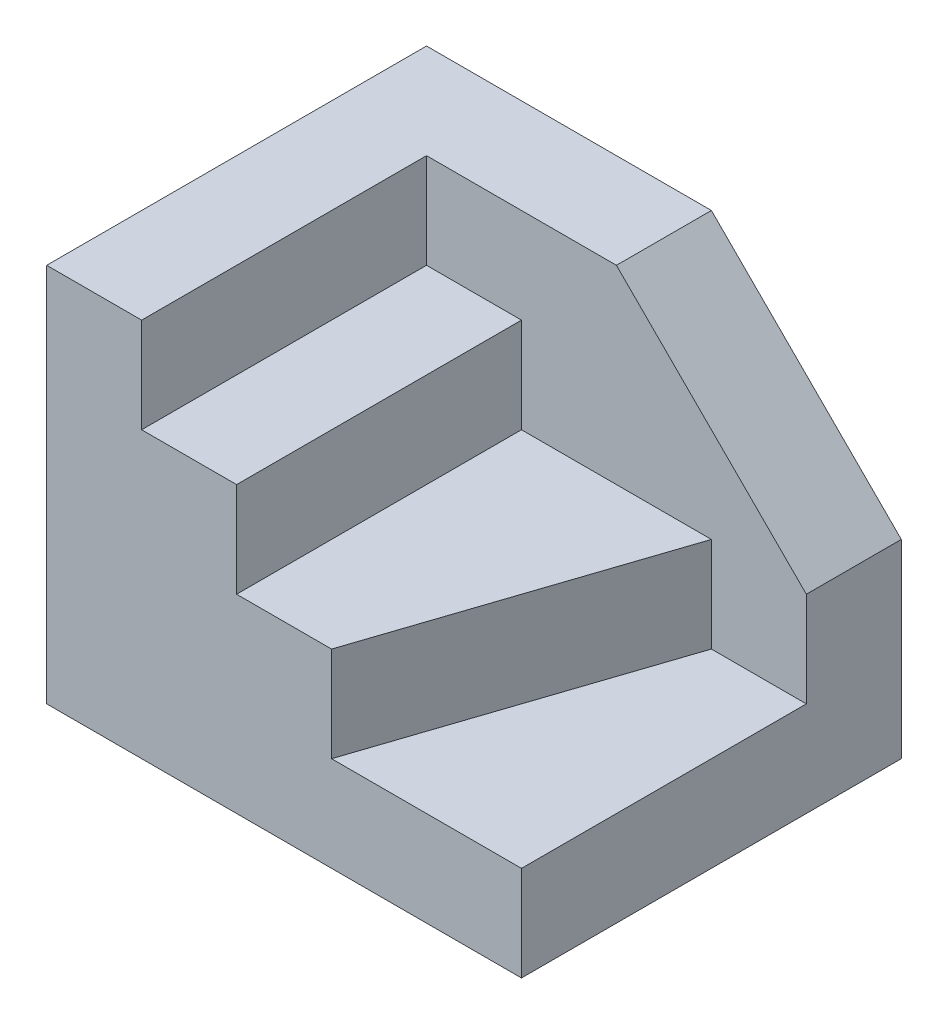
ISO-10303-21;
HEADER;
FILE_DESCRIPTION(('STEP AP214'),'2;1');
FILE_NAME('part.step','',(''),(''),'','','');
FILE_SCHEMA(('AUTOMOTIVE_DESIGN { 1 0 10303 214 1 1 1 1 }'));
ENDSEC;
DATA;
#1=APPLICATION_CONTEXT('core data for automotive mechanical design processes');
#2=APPLICATION_PROTOCOL_DEFINITION('international standard','automotive_design',2000,#1);
#3=PRODUCT_CONTEXT('',#1,'mechanical');
#4=PRODUCT('Part','Part','',(#3));
#5=PRODUCT_RELATED_PRODUCT_CATEGORY('part','',(#4));
#6=PRODUCT_DEFINITION_FORMATION('','',#4);
#7=PRODUCT_DEFINITION_CONTEXT('part definition',#1,'design');
#8=PRODUCT_DEFINITION('design','',#6,#7);
#9=PRODUCT_DEFINITION_SHAPE('','',#8);
#10=(LENGTH_UNIT() NAMED_UNIT(*) SI_UNIT(.MILLI.,.METRE.));
#11=(NAMED_UNIT(*) PLANE_ANGLE_UNIT() SI_UNIT($,.RADIAN.));
#12=(NAMED_UNIT(*) SI_UNIT($,.STERADIAN.) SOLID_ANGLE_UNIT());
#13=UNCERTAINTY_MEASURE_WITH_UNIT(LENGTH_MEASURE(1.E-05),#10,'distance_accuracy_value','');
#14=(GEOMETRIC_REPRESENTATION_CONTEXT(3) GLOBAL_UNCERTAINTY_ASSIGNED_CONTEXT((#13)) GLOBAL_UNIT_ASSIGNED_CONTEXT((#10,
#11,#12)) REPRESENTATION_CONTEXT('',''));
#15=CARTESIAN_POINT('',(0.,0.,0.));
#16=DIRECTION('',(0.,0.,1.));
#17=DIRECTION('',(1.,0.,0.));
#18=AXIS2_PLACEMENT_3D('',#15,#16,#17);
#19=CARTESIAN_POINT('',(0.,1.,0.));
#20=DIRECTION('',(0.,-1.,0.));
#21=DIRECTION('',(0.,0.,-1.));
#22=AXIS2_PLACEMENT_3D('',#19,#20,#21);
#23=PLANE('',#22);
#24=DIRECTION('',(0.316227766016838,0.,-0.948683298050514));
#25=VECTOR('',#24,1.);
#26=CARTESIAN_POINT('',(4.,1.,-3.));
#27=LINE('',#26,#25);
#28=CARTESIAN_POINT('',(3.,1.,0.));
#29=VERTEX_POINT('',#28);
#30=CARTESIAN_POINT('',(4.,1.,-3.));
#31=VERTEX_POINT('',#30);
#32=EDGE_CURVE('E144',#29,#31,#27,.T.);
#33=ORIENTED_EDGE('',*,*,#32,.F.);
#34=DIRECTION('',(1.,0.,0.));
#35=VECTOR('',#34,1.);
#36=CARTESIAN_POINT('',(5.,1.,0.));
#37=LINE('',#36,#35);
#38=CARTESIAN_POINT('',(5.,1.,0.));
#39=VERTEX_POINT('',#38);
#40=EDGE_CURVE('E131',#29,#39,#37,.T.);
#41=ORIENTED_EDGE('',*,*,#40,.T.);
#42=DIRECTION('',(0.,0.,-1.));
#43=VECTOR('',#42,1.);
#44=CARTESIAN_POINT('',(5.,1.,-4.));
#45=LINE('',#44,#43);
#46=CARTESIAN_POINT('',(5.,1.,-3.));
#47=VERTEX_POINT('',#46);
#48=EDGE_CURVE('E202',#39,#47,#45,.T.);
#49=ORIENTED_EDGE('',*,*,#48,.T.);
#50=DIRECTION('',(-1.,0.,0.));
#51=VECTOR('',#50,1.);
#52=CARTESIAN_POINT('',(5.,1.,-3.));
#53=LINE('',#52,#51);
#54=EDGE_CURVE('E177',#47,#31,#53,.T.);
#55=ORIENTED_EDGE('',*,*,#54,.T.);
#56=EDGE_LOOP('',(#33,#41,#49,#55));
#57=FACE_BOUND('',#56,.T.);
#58=ADVANCED_FACE('F35',(#57),#23,.F.);
#59=CARTESIAN_POINT('',(0.,0.,-3.));
#60=DIRECTION('',(0.,0.,-1.));
#61=DIRECTION('',(-1.,0.,0.));
#62=AXIS2_PLACEMENT_3D('',#59,#60,#61);
#63=PLANE('',#62);
#64=DIRECTION('',(0.,-1.,0.));
#65=VECTOR('',#64,1.);
#66=CARTESIAN_POINT('',(4.,2.,-3.));
#67=LINE('',#66,#65);
#68=CARTESIAN_POINT('',(4.,2.,-3.));
#69=VERTEX_POINT('',#68);
#70=EDGE_CURVE('E55',#69,#31,#67,.T.);
#71=ORIENTED_EDGE('',*,*,#70,.T.);
#72=ORIENTED_EDGE('',*,*,#54,.F.);
#73=DIRECTION('',(0.,-1.,0.));
#74=VECTOR('',#73,1.);
#75=CARTESIAN_POINT('',(5.,2.,-3.));
#76=LINE('',#75,#74);
#77=CARTESIAN_POINT('',(5.,2.,-3.));
#78=VERTEX_POINT('',#77);
#79=EDGE_CURVE('E185',#78,#47,#76,.T.);
#80=ORIENTED_EDGE('',*,*,#79,.F.);
#81=DIRECTION('',(0.707106781186548,-0.707106781186547,0.));
#82=VECTOR('',#81,1.);
#83=CARTESIAN_POINT('',(3.,4.,-3.));
#84=LINE('',#83,#82);
#85=CARTESIAN_POINT('',(3.,4.,-3.));
#86=VERTEX_POINT('',#85);
#87=EDGE_CURVE('E182',#86,#78,#84,.T.);
#88=ORIENTED_EDGE('',*,*,#87,.F.);
#89=DIRECTION('',(1.,0.,0.));
#90=VECTOR('',#89,1.);
#91=CARTESIAN_POINT('',(0.,4.,-3.));
#92=LINE('',#91,#90);
#93=CARTESIAN_POINT('',(1.,4.,-3.));
#94=VERTEX_POINT('',#93);
#95=EDGE_CURVE('E179',#94,#86,#92,.T.);
#96=ORIENTED_EDGE('',*,*,#95,.F.);
#97=DIRECTION('',(0.,1.,0.));
#98=VECTOR('',#97,1.);
#99=CARTESIAN_POINT('',(1.,4.,-3.));
#100=LINE('',#99,#98);
#101=CARTESIAN_POINT('',(1.,3.,-3.));
#102=VERTEX_POINT('',#101);
#103=EDGE_CURVE('E157',#102,#94,#100,.T.);
#104=ORIENTED_EDGE('',*,*,#103,.F.);
#105=DIRECTION('',(-1.,0.,0.));
#106=VECTOR('',#105,1.);
#107=CARTESIAN_POINT('',(1.,3.,-3.));
#108=LINE('',#107,#106);
#109=CARTESIAN_POINT('',(2.,3.,-3.));
#110=VERTEX_POINT('',#109);
#111=EDGE_CURVE('E154',#110,#102,#108,.T.);
#112=ORIENTED_EDGE('',*,*,#111,.F.);
#113=DIRECTION('',(0.,1.,0.));
#114=VECTOR('',#113,1.);
#115=CARTESIAN_POINT('',(2.,3.,-3.));
#116=LINE('',#115,#114);
#117=CARTESIAN_POINT('',(2.,2.,-3.));
#118=VERTEX_POINT('',#117);
#119=EDGE_CURVE('E150',#118,#110,#116,.T.);
#120=ORIENTED_EDGE('',*,*,#119,.F.);
#121=DIRECTION('',(-1.,0.,0.));
#122=VECTOR('',#121,1.);
#123=CARTESIAN_POINT('',(2.,2.,-3.));
#124=LINE('',#123,#122);
#125=EDGE_CURVE('E50',#69,#118,#124,.T.);
#126=ORIENTED_EDGE('',*,*,#125,.F.);
#127=EDGE_LOOP('',(#71,#72,#80,#88,#96,#104,#112,#120,#126));
#128=FACE_BOUND('',#127,.T.);
#129=ADVANCED_FACE('F244',(#128),#63,.F.);
#130=CARTESIAN_POINT('',(5.,1.,0.));
#131=DIRECTION('',(0.,0.,-1.));
#132=DIRECTION('',(-1.,0.,0.));
#133=AXIS2_PLACEMENT_3D('',#130,#131,#132);
#134=PLANE('',#133);
#135=DIRECTION('',(1.,0.,0.));
#136=VECTOR('',#135,1.);
#137=CARTESIAN_POINT('',(5.,0.,0.));
#138=LINE('',#137,#136);
#139=CARTESIAN_POINT('',(0.,0.,0.));
#140=VERTEX_POINT('',#139);
#141=CARTESIAN_POINT('',(5.,0.,0.));
#142=VERTEX_POINT('',#141);
#143=EDGE_CURVE('E196',#140,#142,#138,.T.);
#144=ORIENTED_EDGE('',*,*,#143,.T.);
#145=DIRECTION('',(0.,-1.,0.));
#146=VECTOR('',#145,1.);
#147=CARTESIAN_POINT('',(5.,1.,0.));
#148=LINE('',#147,#146);
#149=EDGE_CURVE('E11',#39,#142,#148,.T.);
#150=ORIENTED_EDGE('',*,*,#149,.F.);
#151=ORIENTED_EDGE('',*,*,#40,.F.);
#152=DIRECTION('',(0.,1.,0.));
#153=VECTOR('',#152,1.);
#154=CARTESIAN_POINT('',(3.,2.,0.));
#155=LINE('',#154,#153);
#156=CARTESIAN_POINT('',(3.,2.,0.));
#157=VERTEX_POINT('',#156);
#158=EDGE_CURVE('E125',#29,#157,#155,.T.);
#159=ORIENTED_EDGE('',*,*,#158,.T.);
#160=DIRECTION('',(-1.,0.,0.));
#161=VECTOR('',#160,1.);
#162=CARTESIAN_POINT('',(2.,2.,0.));
#163=LINE('',#162,#161);
#164=CARTESIAN_POINT('',(2.,2.,0.));
#165=VERTEX_POINT('',#164);
#166=EDGE_CURVE('E129',#157,#165,#163,.T.);
#167=ORIENTED_EDGE('',*,*,#166,.T.);
#168=DIRECTION('',(0.,1.,0.));
#169=VECTOR('',#168,1.);
#170=CARTESIAN_POINT('',(2.,3.,0.));
#171=LINE('',#170,#169);
#172=CARTESIAN_POINT('',(2.,3.,0.));
#173=VERTEX_POINT('',#172);
#174=EDGE_CURVE('E141',#165,#173,#171,.T.);
#175=ORIENTED_EDGE('',*,*,#174,.T.);
#176=DIRECTION('',(-1.,0.,0.));
#177=VECTOR('',#176,1.);
#178=CARTESIAN_POINT('',(1.,3.,0.));
#179=LINE('',#178,#177);
#180=CARTESIAN_POINT('',(1.,3.,0.));
#181=VERTEX_POINT('',#180);
#182=EDGE_CURVE('E161',#173,#181,#179,.T.);
#183=ORIENTED_EDGE('',*,*,#182,.T.);
#184=DIRECTION('',(0.,1.,0.));
#185=VECTOR('',#184,1.);
#186=CARTESIAN_POINT('',(1.,4.,0.));
#187=LINE('',#186,#185);
#188=CARTESIAN_POINT('',(1.,4.,0.));
#189=VERTEX_POINT('',#188);
#190=EDGE_CURVE('E164',#181,#189,#187,.T.);
#191=ORIENTED_EDGE('',*,*,#190,.T.);
#192=DIRECTION('',(-1.,0.,0.));
#193=VECTOR('',#192,1.);
#194=CARTESIAN_POINT('',(0.,4.,0.));
#195=LINE('',#194,#193);
#196=CARTESIAN_POINT('',(0.,4.,0.));
#197=VERTEX_POINT('',#196);
#198=EDGE_CURVE('E151',#189,#197,#195,.T.);
#199=ORIENTED_EDGE('',*,*,#198,.T.);
#200=DIRECTION('',(0.,-1.,0.));
#201=VECTOR('',#200,1.);
#202=CARTESIAN_POINT('',(0.,1.,0.));
#203=LINE('',#202,#201);
#204=EDGE_CURVE('E206',#197,#140,#203,.T.);
#205=ORIENTED_EDGE('',*,*,#204,.T.);
#206=EDGE_LOOP('',(#144,#150,#151,#159,#167,#175,#183,#191,#199,#205));
#207=FACE_BOUND('',#206,.T.);
#208=ADVANCED_FACE('F37',(#207),#134,.F.);
#209=CARTESIAN_POINT('',(5.,1.,-4.));
#210=DIRECTION('',(-1.,0.,0.));
#211=DIRECTION('',(0.,0.,1.));
#212=AXIS2_PLACEMENT_3D('',#209,#210,#211);
#213=PLANE('',#212);
#214=DIRECTION('',(0.,0.,-1.));
#215=VECTOR('',#214,1.);
#216=CARTESIAN_POINT('',(5.,0.,-4.));
#217=LINE('',#216,#215);
#218=CARTESIAN_POINT('',(5.,0.,-4.));
#219=VERTEX_POINT('',#218);
#220=EDGE_CURVE('E208',#142,#219,#217,.T.);
#221=ORIENTED_EDGE('',*,*,#220,.T.);
#222=DIRECTION('',(0.,-1.,0.));
#223=VECTOR('',#222,1.);
#224=CARTESIAN_POINT('',(5.,1.,-4.));
#225=LINE('',#224,#223);
#226=CARTESIAN_POINT('',(5.,2.,-4.));
#227=VERTEX_POINT('',#226);
#228=EDGE_CURVE('E43',#227,#219,#225,.T.);
#229=ORIENTED_EDGE('',*,*,#228,.F.);
#230=DIRECTION('',(0.,0.,-1.));
#231=VECTOR('',#230,1.);
#232=CARTESIAN_POINT('',(5.,2.,-3.));
#233=LINE('',#232,#231);
#234=EDGE_CURVE('E193',#78,#227,#233,.T.);
#235=ORIENTED_EDGE('',*,*,#234,.F.);
#236=ORIENTED_EDGE('',*,*,#79,.T.);
#237=ORIENTED_EDGE('',*,*,#48,.F.);
#238=ORIENTED_EDGE('',*,*,#149,.T.);
#239=EDGE_LOOP('',(#221,#229,#235,#236,#237,#238));
#240=FACE_BOUND('',#239,.T.);
#241=ADVANCED_FACE('F241',(#240),#213,.F.);
#242=CARTESIAN_POINT('',(0.,1.,-4.));
#243=DIRECTION('',(0.,0.,1.));
#244=DIRECTION('',(1.,0.,0.));
#245=AXIS2_PLACEMENT_3D('',#242,#243,#244);
#246=PLANE('',#245);
#247=DIRECTION('',(-1.,0.,0.));
#248=VECTOR('',#247,1.);
#249=CARTESIAN_POINT('',(0.,0.,-4.));
#250=LINE('',#249,#248);
#251=CARTESIAN_POINT('',(0.,0.,-4.));
#252=VERTEX_POINT('',#251);
#253=EDGE_CURVE('E210',#219,#252,#250,.T.);
#254=ORIENTED_EDGE('',*,*,#253,.T.);
#255=DIRECTION('',(0.,-1.,0.));
#256=VECTOR('',#255,1.);
#257=CARTESIAN_POINT('',(0.,1.,-4.));
#258=LINE('',#257,#256);
#259=CARTESIAN_POINT('',(0.,4.,-4.));
#260=VERTEX_POINT('',#259);
#261=EDGE_CURVE('E215',#260,#252,#258,.T.);
#262=ORIENTED_EDGE('',*,*,#261,.F.);
#263=DIRECTION('',(1.,0.,0.));
#264=VECTOR('',#263,1.);
#265=CARTESIAN_POINT('',(0.,4.,-4.));
#266=LINE('',#265,#264);
#267=CARTESIAN_POINT('',(3.,4.,-4.));
#268=VERTEX_POINT('',#267);
#269=EDGE_CURVE('E171',#260,#268,#266,.T.);
#270=ORIENTED_EDGE('',*,*,#269,.T.);
#271=DIRECTION('',(0.707106781186548,-0.707106781186547,0.));
#272=VECTOR('',#271,1.);
#273=CARTESIAN_POINT('',(3.,4.,-4.));
#274=LINE('',#273,#272);
#275=EDGE_CURVE('E180',#268,#227,#274,.T.);
#276=ORIENTED_EDGE('',*,*,#275,.T.);
#277=ORIENTED_EDGE('',*,*,#228,.T.);
#278=EDGE_LOOP('',(#254,#262,#270,#276,#277));
#279=FACE_BOUND('',#278,.T.);
#280=ADVANCED_FACE('F220',(#279),#246,.F.);
#281=CARTESIAN_POINT('',(0.,1.,0.));
#282=DIRECTION('',(1.,0.,0.));
#283=DIRECTION('',(0.,0.,-1.));
#284=AXIS2_PLACEMENT_3D('',#281,#282,#283);
#285=PLANE('',#284);
#286=ORIENTED_EDGE('',*,*,#204,.F.);
#287=DIRECTION('',(0.,0.,-1.));
#288=VECTOR('',#287,1.);
#289=CARTESIAN_POINT('',(0.,4.,-3.));
#290=LINE('',#289,#288);
#291=EDGE_CURVE('E188',#197,#260,#290,.T.);
#292=ORIENTED_EDGE('',*,*,#291,.T.);
#293=ORIENTED_EDGE('',*,*,#261,.T.);
#294=DIRECTION('',(0.,0.,1.));
#295=VECTOR('',#294,1.);
#296=CARTESIAN_POINT('',(0.,0.,0.));
#297=LINE('',#296,#295);
#298=EDGE_CURVE('E203',#252,#140,#297,.T.);
#299=ORIENTED_EDGE('',*,*,#298,.T.);
#300=EDGE_LOOP('',(#286,#292,#293,#299));
#301=FACE_BOUND('',#300,.T.);
#302=ADVANCED_FACE('F228',(#301),#285,.F.);
#303=CARTESIAN_POINT('',(0.,0.,0.));
#304=DIRECTION('',(0.,-1.,0.));
#305=DIRECTION('',(0.,0.,-1.));
#306=AXIS2_PLACEMENT_3D('',#303,#304,#305);
#307=PLANE('',#306);
#308=ORIENTED_EDGE('',*,*,#143,.F.);
#309=ORIENTED_EDGE('',*,*,#298,.F.);
#310=ORIENTED_EDGE('',*,*,#253,.F.);
#311=ORIENTED_EDGE('',*,*,#220,.F.);
#312=EDGE_LOOP('',(#308,#309,#310,#311));
#313=FACE_BOUND('',#312,.T.);
#314=ADVANCED_FACE('F226',(#313),#307,.T.);
#315=CARTESIAN_POINT('',(3.,4.,-3.));
#316=DIRECTION('',(0.707106781186547,0.707106781186548,0.));
#317=DIRECTION('',(-0.707106781186548,0.707106781186547,0.));
#318=AXIS2_PLACEMENT_3D('',#315,#316,#317);
#319=PLANE('',#318);
#320=ORIENTED_EDGE('',*,*,#275,.F.);
#321=DIRECTION('',(0.,0.,-1.));
#322=VECTOR('',#321,1.);
#323=CARTESIAN_POINT('',(3.,4.,-3.));
#324=LINE('',#323,#322);
#325=EDGE_CURVE('E197',#86,#268,#324,.T.);
#326=ORIENTED_EDGE('',*,*,#325,.F.);
#327=ORIENTED_EDGE('',*,*,#87,.T.);
#328=ORIENTED_EDGE('',*,*,#234,.T.);
#329=EDGE_LOOP('',(#320,#326,#327,#328));
#330=FACE_BOUND('',#329,.T.);
#331=ADVANCED_FACE('F239',(#330),#319,.T.);
#332=CARTESIAN_POINT('',(0.,4.,-3.));
#333=DIRECTION('',(0.,1.,0.));
#334=DIRECTION('',(-1.,0.,0.));
#335=AXIS2_PLACEMENT_3D('',#332,#333,#334);
#336=PLANE('',#335);
#337=ORIENTED_EDGE('',*,*,#269,.F.);
#338=ORIENTED_EDGE('',*,*,#291,.F.);
#339=ORIENTED_EDGE('',*,*,#198,.F.);
#340=DIRECTION('',(0.,0.,1.));
#341=VECTOR('',#340,1.);
#342=CARTESIAN_POINT('',(1.,4.,-3.));
#343=LINE('',#342,#341);
#344=EDGE_CURVE('E169',#94,#189,#343,.T.);
#345=ORIENTED_EDGE('',*,*,#344,.F.);
#346=ORIENTED_EDGE('',*,*,#95,.T.);
#347=ORIENTED_EDGE('',*,*,#325,.T.);
#348=EDGE_LOOP('',(#337,#338,#339,#345,#346,#347));
#349=FACE_BOUND('',#348,.T.);
#350=ADVANCED_FACE('F234',(#349),#336,.T.);
#351=CARTESIAN_POINT('',(1.,4.,-3.));
#352=DIRECTION('',(1.,0.,0.));
#353=DIRECTION('',(0.,1.,0.));
#354=AXIS2_PLACEMENT_3D('',#351,#352,#353);
#355=PLANE('',#354);
#356=ORIENTED_EDGE('',*,*,#190,.F.);
#357=DIRECTION('',(0.,0.,1.));
#358=VECTOR('',#357,1.);
#359=CARTESIAN_POINT('',(1.,3.,-3.));
#360=LINE('',#359,#358);
#361=EDGE_CURVE('E172',#102,#181,#360,.T.);
#362=ORIENTED_EDGE('',*,*,#361,.F.);
#363=ORIENTED_EDGE('',*,*,#103,.T.);
#364=ORIENTED_EDGE('',*,*,#344,.T.);
#365=EDGE_LOOP('',(#356,#362,#363,#364));
#366=FACE_BOUND('',#365,.T.);
#367=ADVANCED_FACE('F258',(#366),#355,.T.);
#368=CARTESIAN_POINT('',(1.,3.,-3.));
#369=DIRECTION('',(0.,1.,0.));
#370=DIRECTION('',(0.,0.,1.));
#371=AXIS2_PLACEMENT_3D('',#368,#369,#370);
#372=PLANE('',#371);
#373=ORIENTED_EDGE('',*,*,#182,.F.);
#374=DIRECTION('',(0.,0.,1.));
#375=VECTOR('',#374,1.);
#376=CARTESIAN_POINT('',(2.,3.,-3.));
#377=LINE('',#376,#375);
#378=EDGE_CURVE('E174',#110,#173,#377,.T.);
#379=ORIENTED_EDGE('',*,*,#378,.F.);
#380=ORIENTED_EDGE('',*,*,#111,.T.);
#381=ORIENTED_EDGE('',*,*,#361,.T.);
#382=EDGE_LOOP('',(#373,#379,#380,#381));
#383=FACE_BOUND('',#382,.T.);
#384=ADVANCED_FACE('F296',(#383),#372,.T.);
#385=CARTESIAN_POINT('',(2.,3.,-3.));
#386=DIRECTION('',(1.,0.,0.));
#387=DIRECTION('',(0.,1.,0.));
#388=AXIS2_PLACEMENT_3D('',#385,#386,#387);
#389=PLANE('',#388);
#390=ORIENTED_EDGE('',*,*,#174,.F.);
#391=DIRECTION('',(0.,0.,1.));
#392=VECTOR('',#391,1.);
#393=CARTESIAN_POINT('',(2.,2.,-3.));
#394=LINE('',#393,#392);
#395=EDGE_CURVE('E139',#118,#165,#394,.T.);
#396=ORIENTED_EDGE('',*,*,#395,.F.);
#397=ORIENTED_EDGE('',*,*,#119,.T.);
#398=ORIENTED_EDGE('',*,*,#378,.T.);
#399=EDGE_LOOP('',(#390,#396,#397,#398));
#400=FACE_BOUND('',#399,.T.);
#401=ADVANCED_FACE('F304',(#400),#389,.T.);
#402=CARTESIAN_POINT('',(2.,2.,-3.));
#403=DIRECTION('',(0.,1.,0.));
#404=DIRECTION('',(0.,0.,1.));
#405=AXIS2_PLACEMENT_3D('',#402,#403,#404);
#406=PLANE('',#405);
#407=ORIENTED_EDGE('',*,*,#166,.F.);
#408=DIRECTION('',(0.316227766016838,0.,-0.948683298050514));
#409=VECTOR('',#408,1.);
#410=CARTESIAN_POINT('',(4.,2.,-3.));
#411=LINE('',#410,#409);
#412=EDGE_CURVE('E138',#157,#69,#411,.T.);
#413=ORIENTED_EDGE('',*,*,#412,.T.);
#414=ORIENTED_EDGE('',*,*,#125,.T.);
#415=ORIENTED_EDGE('',*,*,#395,.T.);
#416=EDGE_LOOP('',(#407,#413,#414,#415));
#417=FACE_BOUND('',#416,.T.);
#418=ADVANCED_FACE('F137',(#417),#406,.T.);
#419=CARTESIAN_POINT('',(4.,2.,-3.));
#420=DIRECTION('',(-0.948683298050514,0.,-0.316227766016838));
#421=DIRECTION('',(-0.316227766016838,0.,0.948683298050514));
#422=AXIS2_PLACEMENT_3D('',#419,#420,#421);
#423=PLANE('',#422);
#424=ORIENTED_EDGE('',*,*,#32,.T.);
#425=ORIENTED_EDGE('',*,*,#70,.F.);
#426=ORIENTED_EDGE('',*,*,#412,.F.);
#427=ORIENTED_EDGE('',*,*,#158,.F.);
#428=EDGE_LOOP('',(#424,#425,#426,#427));
#429=FACE_BOUND('',#428,.T.);
#430=ADVANCED_FACE('F143',(#429),#423,.F.);
#431=CLOSED_SHELL('',(#58,#129,#208,#241,#280,#302,#314,#331,#350,#367,#384,#401,#418,#430));
#432=MANIFOLD_SOLID_BREP('B2',#431);
#433=ADVANCED_BREP_SHAPE_REPRESENTATION('',(#18,#432),#14);
#434=SHAPE_DEFINITION_REPRESENTATION(#9,#433);
ENDSEC;
END-ISO-10303-21;
